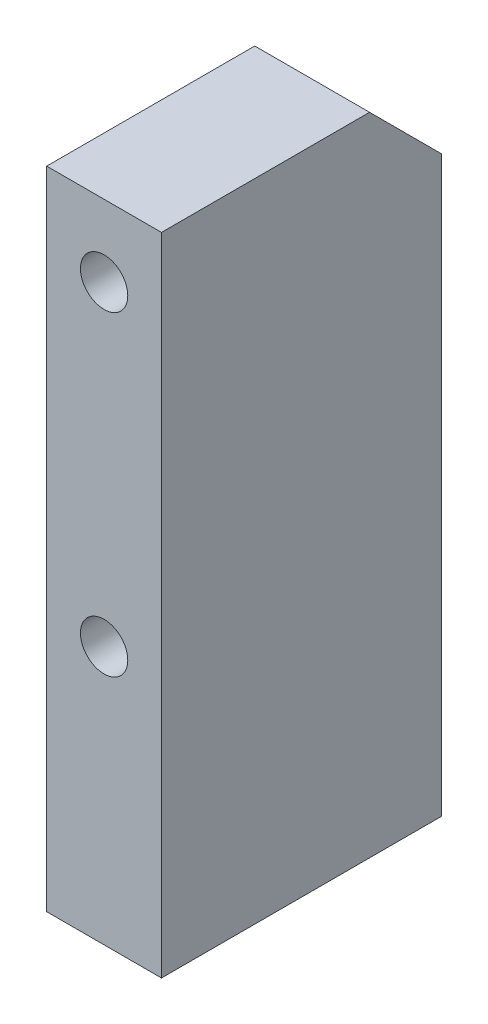
ISO-10303-21;
HEADER;
FILE_DESCRIPTION(('STEP AP214'),'2;1');
FILE_NAME('part.step','',(''),(''),'','','');
FILE_SCHEMA(('AUTOMOTIVE_DESIGN { 1 0 10303 214 1 1 1 1 }'));
ENDSEC;
DATA;
#1=APPLICATION_CONTEXT('core data for automotive mechanical design processes');
#2=APPLICATION_PROTOCOL_DEFINITION('international standard','automotive_design',2000,#1);
#3=PRODUCT_CONTEXT('',#1,'mechanical');
#4=PRODUCT('Part','Part','',(#3));
#5=PRODUCT_RELATED_PRODUCT_CATEGORY('part','',(#4));
#6=PRODUCT_DEFINITION_FORMATION('','',#4);
#7=PRODUCT_DEFINITION_CONTEXT('part definition',#1,'design');
#8=PRODUCT_DEFINITION('design','',#6,#7);
#9=PRODUCT_DEFINITION_SHAPE('','',#8);
#10=(LENGTH_UNIT() NAMED_UNIT(*) SI_UNIT(.MILLI.,.METRE.));
#11=(NAMED_UNIT(*) PLANE_ANGLE_UNIT() SI_UNIT($,.RADIAN.));
#12=(NAMED_UNIT(*) SI_UNIT($,.STERADIAN.) SOLID_ANGLE_UNIT());
#13=UNCERTAINTY_MEASURE_WITH_UNIT(LENGTH_MEASURE(1.E-05),#10,'distance_accuracy_value','');
#14=(GEOMETRIC_REPRESENTATION_CONTEXT(3) GLOBAL_UNCERTAINTY_ASSIGNED_CONTEXT((#13)) GLOBAL_UNIT_ASSIGNED_CONTEXT((#10,
#11,#12)) REPRESENTATION_CONTEXT('',''));
#15=CARTESIAN_POINT('',(0.,0.,0.));
#16=DIRECTION('',(0.,0.,1.));
#17=DIRECTION('',(1.,0.,0.));
#18=AXIS2_PLACEMENT_3D('',#15,#16,#17);
#19=CARTESIAN_POINT('',(0.,13.5000000001355,-15.));
#20=DIRECTION('',(0.,-1.,0.));
#21=DIRECTION('',(1.,0.,0.));
#22=AXIS2_PLACEMENT_3D('',#19,#20,#21);
#23=CONICAL_SURFACE('',#22,1.64999999991323,1.02974425856741);
#24=CARTESIAN_POINT('',(0.,14.4914200215851,-14.9999999999716));
#25=VERTEX_POINT('',#24);
#26=VERTEX_LOOP('',#25);
#27=FACE_BOUND('',#26,.T.);
#28=CARTESIAN_POINT('',(0.,13.5,-15.));
#29=DIRECTION('',(0.,-1.,0.));
#30=DIRECTION('',(0.,0.,-1.));
#31=AXIS2_PLACEMENT_3D('',#28,#29,#30);
#32=CIRCLE('',#31,1.64999999999999);
#33=CARTESIAN_POINT('',(0.,13.5,-16.65));
#34=VERTEX_POINT('',#33);
#35=EDGE_CURVE('E74',#34,#34,#32,.T.);
#36=ORIENTED_EDGE('',*,*,#35,.T.);
#37=EDGE_LOOP('',(#36));
#38=FACE_BOUND('',#37,.T.);
#39=ADVANCED_FACE('F16',(#27,#38),#23,.F.);
#40=CARTESIAN_POINT('',(0.,40.,-13.5000000000787));
#41=DIRECTION('',(0.,0.,1.));
#42=DIRECTION('',(1.,0.,0.));
#43=AXIS2_PLACEMENT_3D('',#40,#41,#42);
#44=CONICAL_SURFACE('',#43,1.64999999998372,1.02974425867096);
#45=CARTESIAN_POINT('',(-5.6843418860808E-11,40.,-14.4914200214146));
#46=VERTEX_POINT('',#45);
#47=VERTEX_LOOP('',#46);
#48=FACE_BOUND('',#47,.T.);
#49=CARTESIAN_POINT('',(0.,40.,-13.5));
#50=DIRECTION('',(0.,0.,1.));
#51=DIRECTION('',(1.,0.,0.));
#52=AXIS2_PLACEMENT_3D('',#49,#50,#51);
#53=CIRCLE('',#52,1.64999999999999);
#54=CARTESIAN_POINT('',(1.64999999999999,40.,-13.5));
#55=VERTEX_POINT('',#54);
#56=EDGE_CURVE('E76',#55,#55,#53,.T.);
#57=ORIENTED_EDGE('',*,*,#56,.T.);
#58=EDGE_LOOP('',(#57));
#59=FACE_BOUND('',#58,.T.);
#60=ADVANCED_FACE('F71',(#48,#59),#44,.F.);
#61=CARTESIAN_POINT('',(0.,18.,-13.5000000000787));
#62=DIRECTION('',(0.,0.,1.));
#63=DIRECTION('',(1.,0.,0.));
#64=AXIS2_PLACEMENT_3D('',#61,#62,#63);
#65=CONICAL_SURFACE('',#64,1.64999999998372,1.02974425867096);
#66=CARTESIAN_POINT('',(-5.6843418860808E-11,18.,-14.4914200214146));
#67=VERTEX_POINT('',#66);
#68=VERTEX_LOOP('',#67);
#69=FACE_BOUND('',#68,.T.);
#70=CARTESIAN_POINT('',(0.,18.,-13.5));
#71=DIRECTION('',(0.,0.,1.));
#72=DIRECTION('',(1.,0.,0.));
#73=AXIS2_PLACEMENT_3D('',#70,#71,#72);
#74=CIRCLE('',#73,1.64999999999999);
#75=CARTESIAN_POINT('',(1.64999999999999,18.,-13.5));
#76=VERTEX_POINT('',#75);
#77=EDGE_CURVE('E79',#76,#76,#74,.T.);
#78=ORIENTED_EDGE('',*,*,#77,.T.);
#79=EDGE_LOOP('',(#78));
#80=FACE_BOUND('',#79,.T.);
#81=ADVANCED_FACE('F101',(#69,#80),#65,.F.);
#82=CARTESIAN_POINT('',(0.,0.,-15.));
#83=DIRECTION('',(0.,-1.,0.));
#84=DIRECTION('',(0.,0.,-1.));
#85=AXIS2_PLACEMENT_3D('',#82,#83,#84);
#86=CYLINDRICAL_SURFACE('',#85,1.64999999999999);
#87=ORIENTED_EDGE('',*,*,#35,.F.);
#88=EDGE_LOOP('',(#87));
#89=FACE_BOUND('',#88,.T.);
#90=CARTESIAN_POINT('',(0.,0.,-15.));
#91=DIRECTION('',(0.,-1.,0.));
#92=DIRECTION('',(0.,0.,-1.));
#93=AXIS2_PLACEMENT_3D('',#90,#91,#92);
#94=CIRCLE('',#93,1.64999999999999);
#95=CARTESIAN_POINT('',(0.,0.,-16.65));
#96=VERTEX_POINT('',#95);
#97=EDGE_CURVE('E19',#96,#96,#94,.T.);
#98=ORIENTED_EDGE('',*,*,#97,.T.);
#99=EDGE_LOOP('',(#98));
#100=FACE_BOUND('',#99,.T.);
#101=ADVANCED_FACE('F185',(#89,#100),#86,.F.);
#102=CARTESIAN_POINT('',(0.,40.,0.));
#103=DIRECTION('',(0.,0.,1.));
#104=DIRECTION('',(1.,0.,0.));
#105=AXIS2_PLACEMENT_3D('',#102,#103,#104);
#106=CYLINDRICAL_SURFACE('',#105,1.64999999999999);
#107=ORIENTED_EDGE('',*,*,#56,.F.);
#108=EDGE_LOOP('',(#107));
#109=FACE_BOUND('',#108,.T.);
#110=CARTESIAN_POINT('',(0.,40.,0.));
#111=DIRECTION('',(0.,0.,1.));
#112=DIRECTION('',(1.,0.,0.));
#113=AXIS2_PLACEMENT_3D('',#110,#111,#112);
#114=CIRCLE('',#113,1.64999999999999);
#115=CARTESIAN_POINT('',(1.64999999999999,40.,0.));
#116=VERTEX_POINT('',#115);
#117=EDGE_CURVE('E86',#116,#116,#114,.T.);
#118=ORIENTED_EDGE('',*,*,#117,.T.);
#119=EDGE_LOOP('',(#118));
#120=FACE_BOUND('',#119,.T.);
#121=ADVANCED_FACE('F107',(#109,#120),#106,.F.);
#122=CARTESIAN_POINT('',(0.,18.,0.));
#123=DIRECTION('',(0.,0.,1.));
#124=DIRECTION('',(1.,0.,0.));
#125=AXIS2_PLACEMENT_3D('',#122,#123,#124);
#126=CYLINDRICAL_SURFACE('',#125,1.64999999999999);
#127=ORIENTED_EDGE('',*,*,#77,.F.);
#128=EDGE_LOOP('',(#127));
#129=FACE_BOUND('',#128,.T.);
#130=CARTESIAN_POINT('',(0.,18.,0.));
#131=DIRECTION('',(0.,0.,1.));
#132=DIRECTION('',(1.,0.,0.));
#133=AXIS2_PLACEMENT_3D('',#130,#131,#132);
#134=CIRCLE('',#133,1.64999999999999);
#135=CARTESIAN_POINT('',(1.64999999999999,18.,0.));
#136=VERTEX_POINT('',#135);
#137=EDGE_CURVE('E83',#136,#136,#134,.T.);
#138=ORIENTED_EDGE('',*,*,#137,.T.);
#139=EDGE_LOOP('',(#138));
#140=FACE_BOUND('',#139,.T.);
#141=ADVANCED_FACE('F103',(#129,#140),#126,.F.);
#142=CARTESIAN_POINT('',(-4.,0.,0.));
#143=DIRECTION('',(-1.,0.,0.));
#144=DIRECTION('',(0.,0.,1.));
#145=AXIS2_PLACEMENT_3D('',#142,#143,#144);
#146=PLANE('',#145);
#147=DIRECTION('',(0.,0.,1.));
#148=VECTOR('',#147,1.);
#149=CARTESIAN_POINT('',(-4.,0.,0.));
#150=LINE('',#149,#148);
#151=CARTESIAN_POINT('',(-4.,0.,-19.5));
#152=VERTEX_POINT('',#151);
#153=CARTESIAN_POINT('',(-4.,0.,0.));
#154=VERTEX_POINT('',#153);
#155=EDGE_CURVE('E88',#152,#154,#150,.T.);
#156=ORIENTED_EDGE('',*,*,#155,.T.);
#157=DIRECTION('',(0.,1.,0.));
#158=VECTOR('',#157,1.);
#159=CARTESIAN_POINT('',(-4.,0.,0.));
#160=LINE('',#159,#158);
#161=CARTESIAN_POINT('',(-4.,45.,0.));
#162=VERTEX_POINT('',#161);
#163=EDGE_CURVE('E163',#154,#162,#160,.T.);
#164=ORIENTED_EDGE('',*,*,#163,.T.);
#165=DIRECTION('',(0.,0.,-1.));
#166=VECTOR('',#165,1.);
#167=CARTESIAN_POINT('',(-4.,45.,0.));
#168=LINE('',#167,#166);
#169=CARTESIAN_POINT('',(-4.,45.,-14.5));
#170=VERTEX_POINT('',#169);
#171=EDGE_CURVE('E159',#162,#170,#168,.T.);
#172=ORIENTED_EDGE('',*,*,#171,.T.);
#173=DIRECTION('',(0.,-0.707106781186549,-0.707106781186546));
#174=VECTOR('',#173,1.);
#175=CARTESIAN_POINT('',(-4.,45.,-14.5));
#176=LINE('',#175,#174);
#177=CARTESIAN_POINT('',(-4.,40.,-19.5));
#178=VERTEX_POINT('',#177);
#179=EDGE_CURVE('E145',#170,#178,#176,.T.);
#180=ORIENTED_EDGE('',*,*,#179,.T.);
#181=DIRECTION('',(0.,1.,0.));
#182=VECTOR('',#181,1.);
#183=CARTESIAN_POINT('',(-4.,0.,-19.5));
#184=LINE('',#183,#182);
#185=EDGE_CURVE('E147',#178,#152,#184,.F.);
#186=ORIENTED_EDGE('',*,*,#185,.T.);
#187=EDGE_LOOP('',(#156,#164,#172,#180,#186));
#188=FACE_BOUND('',#187,.T.);
#189=ADVANCED_FACE('F106',(#188),#146,.T.);
#190=CARTESIAN_POINT('',(4.,0.,0.));
#191=DIRECTION('',(0.,1.,0.));
#192=DIRECTION('',(0.,0.,1.));
#193=AXIS2_PLACEMENT_3D('',#190,#191,#192);
#194=PLANE('',#193);
#195=DIRECTION('',(1.,0.,0.));
#196=VECTOR('',#195,1.);
#197=CARTESIAN_POINT('',(4.,0.,-19.5));
#198=LINE('',#197,#196);
#199=CARTESIAN_POINT('',(4.,0.,-19.5));
#200=VERTEX_POINT('',#199);
#201=EDGE_CURVE('E148',#152,#200,#198,.T.);
#202=ORIENTED_EDGE('',*,*,#201,.T.);
#203=DIRECTION('',(0.,0.,1.));
#204=VECTOR('',#203,1.);
#205=CARTESIAN_POINT('',(4.,0.,0.));
#206=LINE('',#205,#204);
#207=CARTESIAN_POINT('',(4.,0.,0.));
#208=VERTEX_POINT('',#207);
#209=EDGE_CURVE('E150',#200,#208,#206,.T.);
#210=ORIENTED_EDGE('',*,*,#209,.T.);
#211=DIRECTION('',(-1.,0.,0.));
#212=VECTOR('',#211,1.);
#213=CARTESIAN_POINT('',(4.,0.,0.));
#214=LINE('',#213,#212);
#215=EDGE_CURVE('E85',#208,#154,#214,.T.);
#216=ORIENTED_EDGE('',*,*,#215,.T.);
#217=ORIENTED_EDGE('',*,*,#155,.F.);
#218=EDGE_LOOP('',(#202,#210,#216,#217));
#219=FACE_BOUND('',#218,.T.);
#220=ORIENTED_EDGE('',*,*,#97,.F.);
#221=EDGE_LOOP('',(#220));
#222=FACE_BOUND('',#221,.T.);
#223=ADVANCED_FACE('F115',(#219,#222),#194,.F.);
#224=CARTESIAN_POINT('',(4.,0.,0.));
#225=DIRECTION('',(0.,0.,-1.));
#226=DIRECTION('',(-1.,0.,0.));
#227=AXIS2_PLACEMENT_3D('',#224,#225,#226);
#228=PLANE('',#227);
#229=ORIENTED_EDGE('',*,*,#215,.F.);
#230=DIRECTION('',(0.,1.,0.));
#231=VECTOR('',#230,1.);
#232=CARTESIAN_POINT('',(4.,0.,0.));
#233=LINE('',#232,#231);
#234=CARTESIAN_POINT('',(4.,45.,0.));
#235=VERTEX_POINT('',#234);
#236=EDGE_CURVE('E171',#208,#235,#233,.T.);
#237=ORIENTED_EDGE('',*,*,#236,.T.);
#238=DIRECTION('',(1.,0.,0.));
#239=VECTOR('',#238,1.);
#240=CARTESIAN_POINT('',(4.,45.,0.));
#241=LINE('',#240,#239);
#242=EDGE_CURVE('E161',#235,#162,#241,.F.);
#243=ORIENTED_EDGE('',*,*,#242,.T.);
#244=ORIENTED_EDGE('',*,*,#163,.F.);
#245=EDGE_LOOP('',(#229,#237,#243,#244));
#246=FACE_BOUND('',#245,.T.);
#247=ORIENTED_EDGE('',*,*,#137,.F.);
#248=EDGE_LOOP('',(#247));
#249=FACE_BOUND('',#248,.T.);
#250=ORIENTED_EDGE('',*,*,#117,.F.);
#251=EDGE_LOOP('',(#250));
#252=FACE_BOUND('',#251,.T.);
#253=ADVANCED_FACE('F111',(#246,#249,#252),#228,.F.);
#254=CARTESIAN_POINT('',(4.,45.,0.));
#255=DIRECTION('',(0.,-1.,0.));
#256=DIRECTION('',(0.,0.,-1.));
#257=AXIS2_PLACEMENT_3D('',#254,#255,#256);
#258=PLANE('',#257);
#259=DIRECTION('',(1.,0.,0.));
#260=VECTOR('',#259,1.);
#261=CARTESIAN_POINT('',(4.,45.,-14.5));
#262=LINE('',#261,#260);
#263=CARTESIAN_POINT('',(4.,45.,-14.5));
#264=VERTEX_POINT('',#263);
#265=EDGE_CURVE('E157',#264,#170,#262,.F.);
#266=ORIENTED_EDGE('',*,*,#265,.T.);
#267=ORIENTED_EDGE('',*,*,#171,.F.);
#268=ORIENTED_EDGE('',*,*,#242,.F.);
#269=DIRECTION('',(0.,0.,1.));
#270=VECTOR('',#269,1.);
#271=CARTESIAN_POINT('',(4.,45.,0.));
#272=LINE('',#271,#270);
#273=EDGE_CURVE('E174',#235,#264,#272,.F.);
#274=ORIENTED_EDGE('',*,*,#273,.T.);
#275=EDGE_LOOP('',(#266,#267,#268,#274));
#276=FACE_BOUND('',#275,.T.);
#277=ADVANCED_FACE('F114',(#276),#258,.F.);
#278=CARTESIAN_POINT('',(4.,45.,-14.5));
#279=DIRECTION('',(0.,-0.707106781186546,0.707106781186549));
#280=DIRECTION('',(0.,-0.707106781186549,-0.707106781186546));
#281=AXIS2_PLACEMENT_3D('',#278,#279,#280);
#282=PLANE('',#281);
#283=DIRECTION('',(1.,0.,0.));
#284=VECTOR('',#283,1.);
#285=CARTESIAN_POINT('',(4.,40.,-19.5));
#286=LINE('',#285,#284);
#287=CARTESIAN_POINT('',(4.,40.,-19.5));
#288=VERTEX_POINT('',#287);
#289=EDGE_CURVE('E33',#288,#178,#286,.F.);
#290=ORIENTED_EDGE('',*,*,#289,.T.);
#291=ORIENTED_EDGE('',*,*,#179,.F.);
#292=ORIENTED_EDGE('',*,*,#265,.F.);
#293=DIRECTION('',(0.,-0.707106781186549,-0.707106781186546));
#294=VECTOR('',#293,1.);
#295=CARTESIAN_POINT('',(4.,45.,-14.5));
#296=LINE('',#295,#294);
#297=EDGE_CURVE('E25',#264,#288,#296,.T.);
#298=ORIENTED_EDGE('',*,*,#297,.T.);
#299=EDGE_LOOP('',(#290,#291,#292,#298));
#300=FACE_BOUND('',#299,.T.);
#301=ADVANCED_FACE('F123',(#300),#282,.F.);
#302=CARTESIAN_POINT('',(4.,0.,-19.5));
#303=DIRECTION('',(0.,0.,1.));
#304=DIRECTION('',(1.,0.,0.));
#305=AXIS2_PLACEMENT_3D('',#302,#303,#304);
#306=PLANE('',#305);
#307=ORIENTED_EDGE('',*,*,#289,.F.);
#308=DIRECTION('',(0.,1.,0.));
#309=VECTOR('',#308,1.);
#310=CARTESIAN_POINT('',(4.,0.,-19.5));
#311=LINE('',#310,#309);
#312=EDGE_CURVE('E11',#288,#200,#311,.F.);
#313=ORIENTED_EDGE('',*,*,#312,.T.);
#314=ORIENTED_EDGE('',*,*,#201,.F.);
#315=ORIENTED_EDGE('',*,*,#185,.F.);
#316=EDGE_LOOP('',(#307,#313,#314,#315));
#317=FACE_BOUND('',#316,.T.);
#318=ADVANCED_FACE('F130',(#317),#306,.F.);
#319=CARTESIAN_POINT('',(4.,0.,0.));
#320=DIRECTION('',(-1.,0.,0.));
#321=DIRECTION('',(0.,0.,1.));
#322=AXIS2_PLACEMENT_3D('',#319,#320,#321);
#323=PLANE('',#322);
#324=ORIENTED_EDGE('',*,*,#297,.F.);
#325=ORIENTED_EDGE('',*,*,#273,.F.);
#326=ORIENTED_EDGE('',*,*,#236,.F.);
#327=ORIENTED_EDGE('',*,*,#209,.F.);
#328=ORIENTED_EDGE('',*,*,#312,.F.);
#329=EDGE_LOOP('',(#324,#325,#326,#327,#328));
#330=FACE_BOUND('',#329,.T.);
#331=ADVANCED_FACE('F128',(#330),#323,.F.);
#332=CLOSED_SHELL('',(#39,#60,#81,#101,#121,#141,#189,#223,#253,#277,#301,#318,#331));
#333=MANIFOLD_SOLID_BREP('B1',#332);
#334=ADVANCED_BREP_SHAPE_REPRESENTATION('',(#18,#333),#14);
#335=SHAPE_DEFINITION_REPRESENTATION(#9,#334);
ENDSEC;
END-ISO-10303-21;
